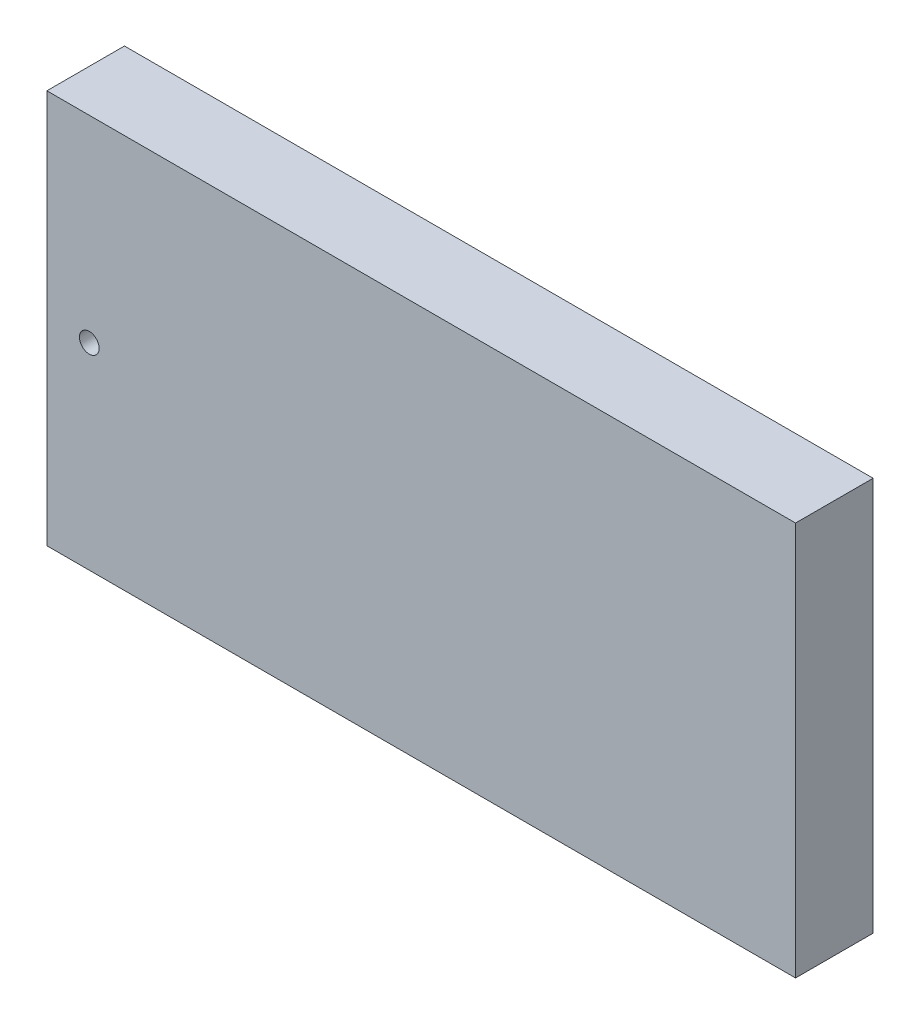
ISO-10303-21;
HEADER;
FILE_DESCRIPTION(('STEP AP214'),'2;1');
FILE_NAME('part.step','',(''),(''),'','','');
FILE_SCHEMA(('AUTOMOTIVE_DESIGN { 1 0 10303 214 1 1 1 1 }'));
ENDSEC;
DATA;
#1=APPLICATION_CONTEXT('core data for automotive mechanical design processes');
#2=APPLICATION_PROTOCOL_DEFINITION('international standard','automotive_design',2000,#1);
#3=PRODUCT_CONTEXT('',#1,'mechanical');
#4=PRODUCT('Part','Part','',(#3));
#5=PRODUCT_RELATED_PRODUCT_CATEGORY('part','',(#4));
#6=PRODUCT_DEFINITION_FORMATION('','',#4);
#7=PRODUCT_DEFINITION_CONTEXT('part definition',#1,'design');
#8=PRODUCT_DEFINITION('design','',#6,#7);
#9=PRODUCT_DEFINITION_SHAPE('','',#8);
#10=(LENGTH_UNIT() NAMED_UNIT(*) SI_UNIT(.MILLI.,.METRE.));
#11=(NAMED_UNIT(*) PLANE_ANGLE_UNIT() SI_UNIT($,.RADIAN.));
#12=(NAMED_UNIT(*) SI_UNIT($,.STERADIAN.) SOLID_ANGLE_UNIT());
#13=UNCERTAINTY_MEASURE_WITH_UNIT(LENGTH_MEASURE(1.E-05),#10,'distance_accuracy_value','');
#14=(GEOMETRIC_REPRESENTATION_CONTEXT(3) GLOBAL_UNCERTAINTY_ASSIGNED_CONTEXT((#13)) GLOBAL_UNIT_ASSIGNED_CONTEXT((#10,
#11,#12)) REPRESENTATION_CONTEXT('',''));
#15=CARTESIAN_POINT('',(0.,0.,0.));
#16=DIRECTION('',(0.,0.,1.));
#17=DIRECTION('',(1.,0.,0.));
#18=AXIS2_PLACEMENT_3D('',#15,#16,#17);
#19=CARTESIAN_POINT('',(482.6,-254.,-100.));
#20=DIRECTION('',(1.,0.,0.));
#21=DIRECTION('',(0.,0.,-1.));
#22=AXIS2_PLACEMENT_3D('',#19,#20,#21);
#23=PLANE('',#22);
#24=DIRECTION('',(0.,1.,0.));
#25=VECTOR('',#24,1.);
#26=CARTESIAN_POINT('',(482.6,-254.,0.));
#27=LINE('',#26,#25);
#28=CARTESIAN_POINT('',(482.6,-254.,0.));
#29=VERTEX_POINT('',#28);
#30=CARTESIAN_POINT('',(482.6,254.,0.));
#31=VERTEX_POINT('',#30);
#32=EDGE_CURVE('E110',#29,#31,#27,.T.);
#33=ORIENTED_EDGE('',*,*,#32,.F.);
#34=DIRECTION('',(0.,0.,1.));
#35=VECTOR('',#34,1.);
#36=CARTESIAN_POINT('',(482.6,-254.,-100.));
#37=LINE('',#36,#35);
#38=CARTESIAN_POINT('',(482.6,-254.,-100.));
#39=VERTEX_POINT('',#38);
#40=EDGE_CURVE('E11',#39,#29,#37,.T.);
#41=ORIENTED_EDGE('',*,*,#40,.F.);
#42=DIRECTION('',(0.,1.,0.));
#43=VECTOR('',#42,1.);
#44=CARTESIAN_POINT('',(482.6,-254.,-100.));
#45=LINE('',#44,#43);
#46=CARTESIAN_POINT('',(482.6,254.,-100.));
#47=VERTEX_POINT('',#46);
#48=EDGE_CURVE('E101',#39,#47,#45,.T.);
#49=ORIENTED_EDGE('',*,*,#48,.T.);
#50=DIRECTION('',(0.,0.,1.));
#51=VECTOR('',#50,1.);
#52=CARTESIAN_POINT('',(482.6,254.,-100.));
#53=LINE('',#52,#51);
#54=EDGE_CURVE('E42',#47,#31,#53,.T.);
#55=ORIENTED_EDGE('',*,*,#54,.T.);
#56=EDGE_LOOP('',(#33,#41,#49,#55));
#57=FACE_BOUND('',#56,.T.);
#58=ADVANCED_FACE('F39',(#57),#23,.T.);
#59=CARTESIAN_POINT('',(-482.6,-254.,-100.));
#60=DIRECTION('',(0.,-1.,0.));
#61=DIRECTION('',(0.,0.,-1.));
#62=AXIS2_PLACEMENT_3D('',#59,#60,#61);
#63=PLANE('',#62);
#64=DIRECTION('',(1.,0.,0.));
#65=VECTOR('',#64,1.);
#66=CARTESIAN_POINT('',(-482.6,-254.,0.));
#67=LINE('',#66,#65);
#68=CARTESIAN_POINT('',(-482.6,-254.,0.));
#69=VERTEX_POINT('',#68);
#70=EDGE_CURVE('E104',#69,#29,#67,.T.);
#71=ORIENTED_EDGE('',*,*,#70,.F.);
#72=DIRECTION('',(0.,0.,1.));
#73=VECTOR('',#72,1.);
#74=CARTESIAN_POINT('',(-482.6,-254.,-100.));
#75=LINE('',#74,#73);
#76=CARTESIAN_POINT('',(-482.6,-254.,-100.));
#77=VERTEX_POINT('',#76);
#78=EDGE_CURVE('E49',#77,#69,#75,.T.);
#79=ORIENTED_EDGE('',*,*,#78,.F.);
#80=DIRECTION('',(1.,0.,0.));
#81=VECTOR('',#80,1.);
#82=CARTESIAN_POINT('',(-482.6,-254.,-100.));
#83=LINE('',#82,#81);
#84=EDGE_CURVE('E96',#77,#39,#83,.T.);
#85=ORIENTED_EDGE('',*,*,#84,.T.);
#86=ORIENTED_EDGE('',*,*,#40,.T.);
#87=EDGE_LOOP('',(#71,#79,#85,#86));
#88=FACE_BOUND('',#87,.T.);
#89=ADVANCED_FACE('F127',(#88),#63,.T.);
#90=CARTESIAN_POINT('',(-482.6,-254.,-100.));
#91=DIRECTION('',(-1.,0.,0.));
#92=DIRECTION('',(0.,0.,1.));
#93=AXIS2_PLACEMENT_3D('',#90,#91,#92);
#94=PLANE('',#93);
#95=DIRECTION('',(0.,-1.,0.));
#96=VECTOR('',#95,1.);
#97=CARTESIAN_POINT('',(-482.6,-254.,0.));
#98=LINE('',#97,#96);
#99=CARTESIAN_POINT('',(-482.6,254.,0.));
#100=VERTEX_POINT('',#99);
#101=EDGE_CURVE('E90',#100,#69,#98,.T.);
#102=ORIENTED_EDGE('',*,*,#101,.F.);
#103=DIRECTION('',(0.,0.,1.));
#104=VECTOR('',#103,1.);
#105=CARTESIAN_POINT('',(-482.6,254.,-100.));
#106=LINE('',#105,#104);
#107=CARTESIAN_POINT('',(-482.6,254.,-100.));
#108=VERTEX_POINT('',#107);
#109=EDGE_CURVE('E85',#108,#100,#106,.T.);
#110=ORIENTED_EDGE('',*,*,#109,.F.);
#111=DIRECTION('',(0.,-1.,0.));
#112=VECTOR('',#111,1.);
#113=CARTESIAN_POINT('',(-482.6,-254.,-100.));
#114=LINE('',#113,#112);
#115=EDGE_CURVE('E88',#108,#77,#114,.T.);
#116=ORIENTED_EDGE('',*,*,#115,.T.);
#117=ORIENTED_EDGE('',*,*,#78,.T.);
#118=EDGE_LOOP('',(#102,#110,#116,#117));
#119=FACE_BOUND('',#118,.T.);
#120=ADVANCED_FACE('F87',(#119),#94,.T.);
#121=CARTESIAN_POINT('',(-482.6,254.,-100.));
#122=DIRECTION('',(0.,1.,0.));
#123=DIRECTION('',(0.,0.,1.));
#124=AXIS2_PLACEMENT_3D('',#121,#122,#123);
#125=PLANE('',#124);
#126=DIRECTION('',(-1.,0.,0.));
#127=VECTOR('',#126,1.);
#128=CARTESIAN_POINT('',(-482.6,254.,0.));
#129=LINE('',#128,#127);
#130=EDGE_CURVE('E114',#31,#100,#129,.T.);
#131=ORIENTED_EDGE('',*,*,#130,.F.);
#132=ORIENTED_EDGE('',*,*,#54,.F.);
#133=DIRECTION('',(-1.,0.,0.));
#134=VECTOR('',#133,1.);
#135=CARTESIAN_POINT('',(-482.6,254.,-100.));
#136=LINE('',#135,#134);
#137=EDGE_CURVE('E95',#47,#108,#136,.T.);
#138=ORIENTED_EDGE('',*,*,#137,.T.);
#139=ORIENTED_EDGE('',*,*,#109,.T.);
#140=EDGE_LOOP('',(#131,#132,#138,#139));
#141=FACE_BOUND('',#140,.T.);
#142=ADVANCED_FACE('F99',(#141),#125,.T.);
#143=CARTESIAN_POINT('',(0.,0.,-100.));
#144=DIRECTION('',(0.,0.,-1.));
#145=DIRECTION('',(-1.,0.,0.));
#146=AXIS2_PLACEMENT_3D('',#143,#144,#145);
#147=PLANE('',#146);
#148=CARTESIAN_POINT('',(-427.956480022389,0.,-100.));
#149=DIRECTION('',(0.,0.,1.));
#150=DIRECTION('',(1.,0.,0.));
#151=AXIS2_PLACEMENT_3D('',#148,#149,#150);
#152=CIRCLE('',#151,12.7);
#153=CARTESIAN_POINT('',(-415.256480022389,0.,-100.));
#154=VERTEX_POINT('',#153);
#155=EDGE_CURVE('E115',#154,#154,#152,.T.);
#156=ORIENTED_EDGE('',*,*,#155,.T.);
#157=EDGE_LOOP('',(#156));
#158=FACE_BOUND('',#157,.T.);
#159=ORIENTED_EDGE('',*,*,#48,.F.);
#160=ORIENTED_EDGE('',*,*,#84,.F.);
#161=ORIENTED_EDGE('',*,*,#115,.F.);
#162=ORIENTED_EDGE('',*,*,#137,.F.);
#163=EDGE_LOOP('',(#159,#160,#161,#162));
#164=FACE_BOUND('',#163,.T.);
#165=ADVANCED_FACE('F94',(#158,#164),#147,.T.);
#166=CARTESIAN_POINT('',(0.,0.,0.));
#167=DIRECTION('',(0.,0.,-1.));
#168=DIRECTION('',(-1.,0.,0.));
#169=AXIS2_PLACEMENT_3D('',#166,#167,#168);
#170=PLANE('',#169);
#171=CARTESIAN_POINT('',(-427.956480022389,0.,0.));
#172=DIRECTION('',(0.,0.,1.));
#173=DIRECTION('',(1.,0.,0.));
#174=AXIS2_PLACEMENT_3D('',#171,#172,#173);
#175=CIRCLE('',#174,12.7);
#176=CARTESIAN_POINT('',(-415.256480022389,0.,0.));
#177=VERTEX_POINT('',#176);
#178=EDGE_CURVE('E157',#177,#177,#175,.T.);
#179=ORIENTED_EDGE('',*,*,#178,.F.);
#180=EDGE_LOOP('',(#179));
#181=FACE_BOUND('',#180,.T.);
#182=ORIENTED_EDGE('',*,*,#32,.T.);
#183=ORIENTED_EDGE('',*,*,#130,.T.);
#184=ORIENTED_EDGE('',*,*,#101,.T.);
#185=ORIENTED_EDGE('',*,*,#70,.T.);
#186=EDGE_LOOP('',(#182,#183,#184,#185));
#187=FACE_BOUND('',#186,.T.);
#188=ADVANCED_FACE('F126',(#181,#187),#170,.F.);
#189=CARTESIAN_POINT('',(-427.956480022389,0.,-100.));
#190=DIRECTION('',(0.,0.,1.));
#191=DIRECTION('',(1.,0.,0.));
#192=AXIS2_PLACEMENT_3D('',#189,#190,#191);
#193=CYLINDRICAL_SURFACE('',#192,12.7);
#194=ORIENTED_EDGE('',*,*,#155,.F.);
#195=EDGE_LOOP('',(#194));
#196=FACE_BOUND('',#195,.T.);
#197=ORIENTED_EDGE('',*,*,#178,.T.);
#198=EDGE_LOOP('',(#197));
#199=FACE_BOUND('',#198,.T.);
#200=ADVANCED_FACE('F145',(#196,#199),#193,.F.);
#201=CLOSED_SHELL('',(#58,#89,#120,#142,#165,#188,#200));
#202=MANIFOLD_SOLID_BREP('B2',#201);
#203=ADVANCED_BREP_SHAPE_REPRESENTATION('',(#18,#202),#14);
#204=SHAPE_DEFINITION_REPRESENTATION(#9,#203);
ENDSEC;
END-ISO-10303-21;
